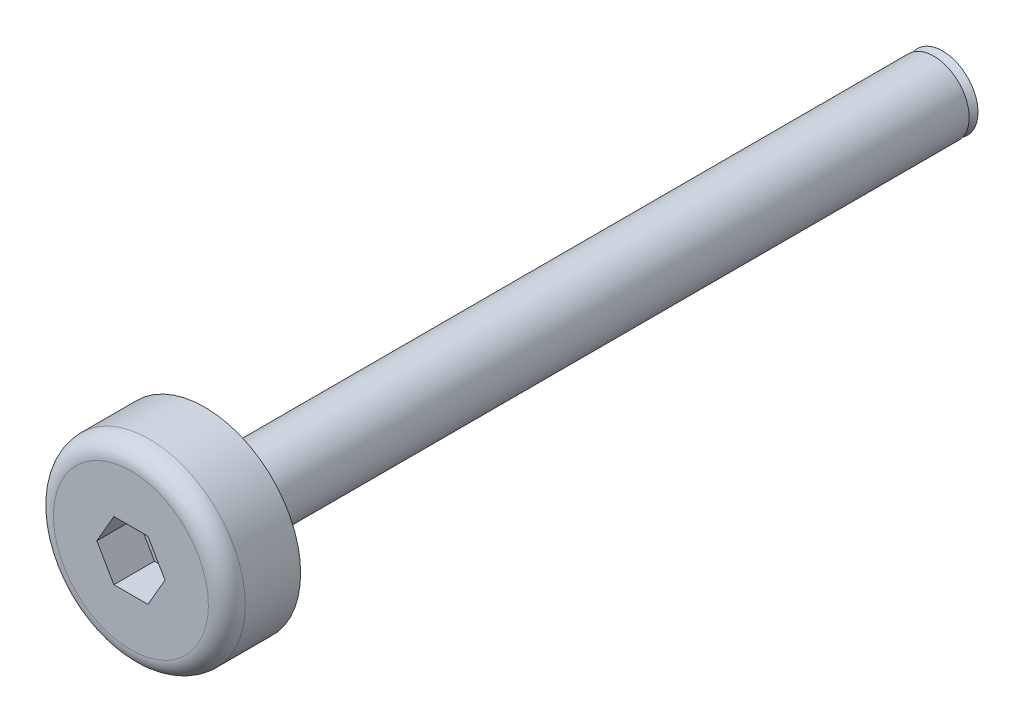
ISO-10303-21;
HEADER;
FILE_DESCRIPTION(('STEP AP214'),'2;1');
FILE_NAME('part.step','',(''),(''),'','','');
FILE_SCHEMA(('AUTOMOTIVE_DESIGN { 1 0 10303 214 1 1 1 1 }'));
ENDSEC;
DATA;
#1=APPLICATION_CONTEXT('core data for automotive mechanical design processes');
#2=APPLICATION_PROTOCOL_DEFINITION('international standard','automotive_design',2000,#1);
#3=PRODUCT_CONTEXT('',#1,'mechanical');
#4=PRODUCT('Part','Part','',(#3));
#5=PRODUCT_RELATED_PRODUCT_CATEGORY('part','',(#4));
#6=PRODUCT_DEFINITION_FORMATION('','',#4);
#7=PRODUCT_DEFINITION_CONTEXT('part definition',#1,'design');
#8=PRODUCT_DEFINITION('design','',#6,#7);
#9=PRODUCT_DEFINITION_SHAPE('','',#8);
#10=(LENGTH_UNIT() NAMED_UNIT(*) SI_UNIT(.MILLI.,.METRE.));
#11=(NAMED_UNIT(*) PLANE_ANGLE_UNIT() SI_UNIT($,.RADIAN.));
#12=(NAMED_UNIT(*) SI_UNIT($,.STERADIAN.) SOLID_ANGLE_UNIT());
#13=UNCERTAINTY_MEASURE_WITH_UNIT(LENGTH_MEASURE(1.E-05),#10,'distance_accuracy_value','');
#14=(GEOMETRIC_REPRESENTATION_CONTEXT(3) GLOBAL_UNCERTAINTY_ASSIGNED_CONTEXT((#13)) GLOBAL_UNIT_ASSIGNED_CONTEXT((#10,
#11,#12)) REPRESENTATION_CONTEXT('',''));
#15=CARTESIAN_POINT('',(0.,0.,0.));
#16=DIRECTION('',(0.,0.,1.));
#17=DIRECTION('',(1.,0.,0.));
#18=AXIS2_PLACEMENT_3D('',#15,#16,#17);
#19=CARTESIAN_POINT('',(0.,0.,2.5));
#20=DIRECTION('',(0.,0.,1.));
#21=DIRECTION('',(1.,0.,0.));
#22=AXIS2_PLACEMENT_3D('',#19,#20,#21);
#23=PLANE('',#22);
#24=CARTESIAN_POINT('',(0.,0.,2.5));
#25=DIRECTION('',(0.,0.,1.));
#26=DIRECTION('',(1.,0.,0.));
#27=AXIS2_PLACEMENT_3D('',#24,#25,#26);
#28=CIRCLE('',#27,2.625);
#29=CARTESIAN_POINT('',(2.625,0.,2.5));
#30=VERTEX_POINT('',#29);
#31=EDGE_CURVE('E142',#30,#30,#28,.T.);
#32=ORIENTED_EDGE('',*,*,#31,.T.);
#33=EDGE_LOOP('',(#32));
#34=FACE_BOUND('',#33,.T.);
#35=DIRECTION('',(0.5,-0.866025403784439,0.));
#36=VECTOR('',#35,1.);
#37=CARTESIAN_POINT('',(0.866025403784439,0.5,2.5));
#38=LINE('',#37,#36);
#39=CARTESIAN_POINT('',(0.577350269189626,1.,2.5));
#40=VERTEX_POINT('',#39);
#41=CARTESIAN_POINT('',(1.15470053837925,0.,2.5));
#42=VERTEX_POINT('',#41);
#43=EDGE_CURVE('E51',#40,#42,#38,.T.);
#44=ORIENTED_EDGE('',*,*,#43,.T.);
#45=DIRECTION('',(-0.5,-0.866025403784439,0.));
#46=VECTOR('',#45,1.);
#47=CARTESIAN_POINT('',(0.866025403784439,-0.5,2.5));
#48=LINE('',#47,#46);
#49=CARTESIAN_POINT('',(0.577350269189626,-1.,2.5));
#50=VERTEX_POINT('',#49);
#51=EDGE_CURVE('E11',#42,#50,#48,.T.);
#52=ORIENTED_EDGE('',*,*,#51,.T.);
#53=DIRECTION('',(-1.,0.,0.));
#54=VECTOR('',#53,1.);
#55=CARTESIAN_POINT('',(0.,-1.,2.5));
#56=LINE('',#55,#54);
#57=CARTESIAN_POINT('',(-0.577350269189626,-1.,2.5));
#58=VERTEX_POINT('',#57);
#59=EDGE_CURVE('E148',#50,#58,#56,.T.);
#60=ORIENTED_EDGE('',*,*,#59,.T.);
#61=DIRECTION('',(-0.5,0.866025403784439,0.));
#62=VECTOR('',#61,1.);
#63=CARTESIAN_POINT('',(-0.866025403784439,-0.5,2.5));
#64=LINE('',#63,#62);
#65=CARTESIAN_POINT('',(-1.15470053837925,0.,2.5));
#66=VERTEX_POINT('',#65);
#67=EDGE_CURVE('E151',#58,#66,#64,.T.);
#68=ORIENTED_EDGE('',*,*,#67,.T.);
#69=DIRECTION('',(0.5,0.866025403784439,0.));
#70=VECTOR('',#69,1.);
#71=CARTESIAN_POINT('',(-0.866025403784438,0.5,2.5));
#72=LINE('',#71,#70);
#73=CARTESIAN_POINT('',(-0.577350269189625,0.999999999999999,2.5));
#74=VERTEX_POINT('',#73);
#75=EDGE_CURVE('E154',#66,#74,#72,.T.);
#76=ORIENTED_EDGE('',*,*,#75,.T.);
#77=DIRECTION('',(1.,0.,0.));
#78=VECTOR('',#77,1.);
#79=CARTESIAN_POINT('',(0.,1.,2.5));
#80=LINE('',#79,#78);
#81=EDGE_CURVE('E157',#74,#40,#80,.T.);
#82=ORIENTED_EDGE('',*,*,#81,.T.);
#83=EDGE_LOOP('',(#44,#52,#60,#68,#76,#82));
#84=FACE_BOUND('',#83,.T.);
#85=ADVANCED_FACE('F43',(#34,#84),#23,.T.);
#86=CARTESIAN_POINT('',(0.,0.,2.5));
#87=DIRECTION('',(0.,0.,-1.));
#88=DIRECTION('',(-1.,0.,0.));
#89=AXIS2_PLACEMENT_3D('',#86,#87,#88);
#90=CYLINDRICAL_SURFACE('',#89,3.25);
#91=CARTESIAN_POINT('',(0.,0.,1.875));
#92=DIRECTION('',(0.,0.,1.));
#93=DIRECTION('',(1.,0.,0.));
#94=AXIS2_PLACEMENT_3D('',#91,#92,#93);
#95=CIRCLE('',#94,3.25);
#96=CARTESIAN_POINT('',(3.25,0.,1.875));
#97=VERTEX_POINT('',#96);
#98=EDGE_CURVE('E145',#97,#97,#95,.F.);
#99=ORIENTED_EDGE('',*,*,#98,.T.);
#100=EDGE_LOOP('',(#99));
#101=FACE_BOUND('',#100,.T.);
#102=CARTESIAN_POINT('',(0.,0.,0.));
#103=DIRECTION('',(0.,0.,1.));
#104=DIRECTION('',(1.,0.,0.));
#105=AXIS2_PLACEMENT_3D('',#102,#103,#104);
#106=CIRCLE('',#105,3.25);
#107=CARTESIAN_POINT('',(3.25,0.,0.));
#108=VERTEX_POINT('',#107);
#109=EDGE_CURVE('E100',#108,#108,#106,.T.);
#110=ORIENTED_EDGE('',*,*,#109,.T.);
#111=EDGE_LOOP('',(#110));
#112=FACE_BOUND('',#111,.T.);
#113=ADVANCED_FACE('F181',(#101,#112),#90,.T.);
#114=CARTESIAN_POINT('',(0.,0.,0.));
#115=DIRECTION('',(0.,0.,1.));
#116=DIRECTION('',(1.,0.,0.));
#117=AXIS2_PLACEMENT_3D('',#114,#115,#116);
#118=PLANE('',#117);
#119=CARTESIAN_POINT('',(0.,0.,0.));
#120=DIRECTION('',(0.,0.,1.));
#121=DIRECTION('',(1.,0.,0.));
#122=AXIS2_PLACEMENT_3D('',#119,#120,#121);
#123=CIRCLE('',#122,1.2);
#124=CARTESIAN_POINT('',(1.2,0.,0.));
#125=VERTEX_POINT('',#124);
#126=EDGE_CURVE('E119',#125,#125,#123,.T.);
#127=ORIENTED_EDGE('',*,*,#126,.T.);
#128=EDGE_LOOP('',(#127));
#129=FACE_BOUND('',#128,.T.);
#130=ORIENTED_EDGE('',*,*,#109,.F.);
#131=EDGE_LOOP('',(#130));
#132=FACE_BOUND('',#131,.T.);
#133=ADVANCED_FACE('F187',(#129,#132),#118,.F.);
#134=CARTESIAN_POINT('',(0.,0.,1.875));
#135=DIRECTION('',(0.,0.,1.));
#136=DIRECTION('',(1.,0.,0.));
#137=AXIS2_PLACEMENT_3D('',#134,#135,#136);
#138=TOROIDAL_SURFACE('',#137,2.625,0.625);
#139=ORIENTED_EDGE('',*,*,#98,.F.);
#140=EDGE_LOOP('',(#139));
#141=FACE_BOUND('',#140,.T.);
#142=ORIENTED_EDGE('',*,*,#31,.F.);
#143=EDGE_LOOP('',(#142));
#144=FACE_BOUND('',#143,.T.);
#145=ADVANCED_FACE('F45',(#141,#144),#138,.T.);
#146=CARTESIAN_POINT('',(0.577350269189626,-1.,2.51));
#147=DIRECTION('',(-0.866025403784439,0.5,0.));
#148=DIRECTION('',(-0.5,-0.866025403784439,0.));
#149=AXIS2_PLACEMENT_3D('',#146,#147,#148);
#150=PLANE('',#149);
#151=DIRECTION('',(0.,0.,-1.));
#152=VECTOR('',#151,1.);
#153=CARTESIAN_POINT('',(1.15470053837925,0.,2.51));
#154=LINE('',#153,#152);
#155=CARTESIAN_POINT('',(1.15470053837925,0.,1.125));
#156=VERTEX_POINT('',#155);
#157=EDGE_CURVE('E93',#42,#156,#154,.T.);
#158=ORIENTED_EDGE('',*,*,#157,.T.);
#159=DIRECTION('',(0.5,0.866025403784439,0.));
#160=VECTOR('',#159,1.);
#161=CARTESIAN_POINT('',(0.577350269189626,-1.,1.125));
#162=LINE('',#161,#160);
#163=CARTESIAN_POINT('',(0.577350269189626,-1.,1.125));
#164=VERTEX_POINT('',#163);
#165=EDGE_CURVE('E97',#164,#156,#162,.T.);
#166=ORIENTED_EDGE('',*,*,#165,.F.);
#167=DIRECTION('',(0.,0.,-1.));
#168=VECTOR('',#167,1.);
#169=CARTESIAN_POINT('',(0.577350269189626,-1.,2.51));
#170=LINE('',#169,#168);
#171=EDGE_CURVE('E132',#50,#164,#170,.T.);
#172=ORIENTED_EDGE('',*,*,#171,.F.);
#173=ORIENTED_EDGE('',*,*,#51,.F.);
#174=EDGE_LOOP('',(#158,#166,#172,#173));
#175=FACE_BOUND('',#174,.T.);
#176=ADVANCED_FACE('F95',(#175),#150,.T.);
#177=CARTESIAN_POINT('',(1.15470053837925,0.,2.51));
#178=DIRECTION('',(-0.866025403784439,-0.5,0.));
#179=DIRECTION('',(0.,0.,1.));
#180=AXIS2_PLACEMENT_3D('',#177,#178,#179);
#181=PLANE('',#180);
#182=DIRECTION('',(0.,0.,-1.));
#183=VECTOR('',#182,1.);
#184=CARTESIAN_POINT('',(0.577350269189626,1.,2.51));
#185=LINE('',#184,#183);
#186=CARTESIAN_POINT('',(0.577350269189626,1.,1.125));
#187=VERTEX_POINT('',#186);
#188=EDGE_CURVE('E101',#40,#187,#185,.T.);
#189=ORIENTED_EDGE('',*,*,#188,.T.);
#190=DIRECTION('',(-0.5,0.866025403784439,0.));
#191=VECTOR('',#190,1.);
#192=CARTESIAN_POINT('',(1.15470053837925,0.,1.125));
#193=LINE('',#192,#191);
#194=EDGE_CURVE('E104',#156,#187,#193,.T.);
#195=ORIENTED_EDGE('',*,*,#194,.F.);
#196=ORIENTED_EDGE('',*,*,#157,.F.);
#197=ORIENTED_EDGE('',*,*,#43,.F.);
#198=EDGE_LOOP('',(#189,#195,#196,#197));
#199=FACE_BOUND('',#198,.T.);
#200=ADVANCED_FACE('F105',(#199),#181,.T.);
#201=CARTESIAN_POINT('',(0.577350269189626,1.,2.51));
#202=DIRECTION('',(0.,-1.,0.));
#203=DIRECTION('',(1.,0.,0.));
#204=AXIS2_PLACEMENT_3D('',#201,#202,#203);
#205=PLANE('',#204);
#206=DIRECTION('',(0.,0.,-1.));
#207=VECTOR('',#206,1.);
#208=CARTESIAN_POINT('',(-0.577350269189625,0.999999999999999,2.51));
#209=LINE('',#208,#207);
#210=CARTESIAN_POINT('',(-0.577350269189625,0.999999999999999,1.125));
#211=VERTEX_POINT('',#210);
#212=EDGE_CURVE('E137',#74,#211,#209,.T.);
#213=ORIENTED_EDGE('',*,*,#212,.T.);
#214=DIRECTION('',(-1.,0.,0.));
#215=VECTOR('',#214,1.);
#216=CARTESIAN_POINT('',(0.577350269189626,1.,1.125));
#217=LINE('',#216,#215);
#218=EDGE_CURVE('E110',#187,#211,#217,.T.);
#219=ORIENTED_EDGE('',*,*,#218,.F.);
#220=ORIENTED_EDGE('',*,*,#188,.F.);
#221=ORIENTED_EDGE('',*,*,#81,.F.);
#222=EDGE_LOOP('',(#213,#219,#220,#221));
#223=FACE_BOUND('',#222,.T.);
#224=ADVANCED_FACE('F161',(#223),#205,.T.);
#225=CARTESIAN_POINT('',(-0.577350269189625,0.999999999999999,2.51));
#226=DIRECTION('',(0.866025403784439,-0.5,0.));
#227=DIRECTION('',(0.5,0.866025403784439,0.));
#228=AXIS2_PLACEMENT_3D('',#225,#226,#227);
#229=PLANE('',#228);
#230=DIRECTION('',(0.,0.,-1.));
#231=VECTOR('',#230,1.);
#232=CARTESIAN_POINT('',(-1.15470053837925,0.,2.51));
#233=LINE('',#232,#231);
#234=CARTESIAN_POINT('',(-1.15470053837925,0.,1.125));
#235=VERTEX_POINT('',#234);
#236=EDGE_CURVE('E135',#66,#235,#233,.T.);
#237=ORIENTED_EDGE('',*,*,#236,.T.);
#238=DIRECTION('',(-0.5,-0.866025403784439,0.));
#239=VECTOR('',#238,1.);
#240=CARTESIAN_POINT('',(-0.577350269189625,0.999999999999999,1.125));
#241=LINE('',#240,#239);
#242=EDGE_CURVE('E126',#211,#235,#241,.T.);
#243=ORIENTED_EDGE('',*,*,#242,.F.);
#244=ORIENTED_EDGE('',*,*,#212,.F.);
#245=ORIENTED_EDGE('',*,*,#75,.F.);
#246=EDGE_LOOP('',(#237,#243,#244,#245));
#247=FACE_BOUND('',#246,.T.);
#248=ADVANCED_FACE('F166',(#247),#229,.T.);
#249=CARTESIAN_POINT('',(-1.15470053837925,0.,2.51));
#250=DIRECTION('',(0.866025403784439,0.5,0.));
#251=DIRECTION('',(-0.5,0.866025403784439,0.));
#252=AXIS2_PLACEMENT_3D('',#249,#250,#251);
#253=PLANE('',#252);
#254=DIRECTION('',(0.,0.,-1.));
#255=VECTOR('',#254,1.);
#256=CARTESIAN_POINT('',(-0.577350269189626,-1.,2.51));
#257=LINE('',#256,#255);
#258=CARTESIAN_POINT('',(-0.577350269189626,-1.,1.125));
#259=VERTEX_POINT('',#258);
#260=EDGE_CURVE('E58',#58,#259,#257,.T.);
#261=ORIENTED_EDGE('',*,*,#260,.T.);
#262=DIRECTION('',(0.5,-0.866025403784439,0.));
#263=VECTOR('',#262,1.);
#264=CARTESIAN_POINT('',(-1.15470053837925,0.,1.125));
#265=LINE('',#264,#263);
#266=EDGE_CURVE('E129',#235,#259,#265,.T.);
#267=ORIENTED_EDGE('',*,*,#266,.F.);
#268=ORIENTED_EDGE('',*,*,#236,.F.);
#269=ORIENTED_EDGE('',*,*,#67,.F.);
#270=EDGE_LOOP('',(#261,#267,#268,#269));
#271=FACE_BOUND('',#270,.T.);
#272=ADVANCED_FACE('F169',(#271),#253,.T.);
#273=CARTESIAN_POINT('',(-0.577350269189626,-1.,2.51));
#274=DIRECTION('',(0.,1.,0.));
#275=DIRECTION('',(-1.,0.,0.));
#276=AXIS2_PLACEMENT_3D('',#273,#274,#275);
#277=PLANE('',#276);
#278=ORIENTED_EDGE('',*,*,#171,.T.);
#279=DIRECTION('',(1.,0.,0.));
#280=VECTOR('',#279,1.);
#281=CARTESIAN_POINT('',(-0.577350269189626,-1.,1.125));
#282=LINE('',#281,#280);
#283=EDGE_CURVE('E115',#259,#164,#282,.T.);
#284=ORIENTED_EDGE('',*,*,#283,.F.);
#285=ORIENTED_EDGE('',*,*,#260,.F.);
#286=ORIENTED_EDGE('',*,*,#59,.F.);
#287=EDGE_LOOP('',(#278,#284,#285,#286));
#288=FACE_BOUND('',#287,.T.);
#289=ADVANCED_FACE('F170',(#288),#277,.T.);
#290=CARTESIAN_POINT('',(1.15470053837925,0.,1.125));
#291=DIRECTION('',(0.,0.,1.));
#292=DIRECTION('',(-0.5,0.866025403784439,0.));
#293=AXIS2_PLACEMENT_3D('',#290,#291,#292);
#294=PLANE('',#293);
#295=ORIENTED_EDGE('',*,*,#165,.T.);
#296=ORIENTED_EDGE('',*,*,#194,.T.);
#297=ORIENTED_EDGE('',*,*,#218,.T.);
#298=ORIENTED_EDGE('',*,*,#242,.T.);
#299=ORIENTED_EDGE('',*,*,#266,.T.);
#300=ORIENTED_EDGE('',*,*,#283,.T.);
#301=EDGE_LOOP('',(#295,#296,#297,#298,#299,#300));
#302=FACE_BOUND('',#301,.T.);
#303=ADVANCED_FACE('F113',(#302),#294,.T.);
#304=CARTESIAN_POINT('',(0.,0.,0.));
#305=DIRECTION('',(0.,0.,-1.));
#306=DIRECTION('',(-1.,0.,0.));
#307=AXIS2_PLACEMENT_3D('',#304,#305,#306);
#308=CYLINDRICAL_SURFACE('',#307,1.2);
#309=ORIENTED_EDGE('',*,*,#126,.F.);
#310=EDGE_LOOP('',(#309));
#311=FACE_BOUND('',#310,.T.);
#312=CARTESIAN_POINT('',(0.,0.,-24.7));
#313=DIRECTION('',(0.,0.,1.));
#314=DIRECTION('',(1.,0.,0.));
#315=AXIS2_PLACEMENT_3D('',#312,#313,#314);
#316=CIRCLE('',#315,1.2);
#317=CARTESIAN_POINT('',(1.2,0.,-24.7));
#318=VERTEX_POINT('',#317);
#319=EDGE_CURVE('E122',#318,#318,#316,.T.);
#320=ORIENTED_EDGE('',*,*,#319,.T.);
#321=EDGE_LOOP('',(#320));
#322=FACE_BOUND('',#321,.T.);
#323=ADVANCED_FACE('F177',(#311,#322),#308,.T.);
#324=CARTESIAN_POINT('',(0.,0.,-24.7));
#325=DIRECTION('',(0.,0.,1.));
#326=DIRECTION('',(1.,0.,0.));
#327=AXIS2_PLACEMENT_3D('',#324,#325,#326);
#328=PLANE('',#327);
#329=CARTESIAN_POINT('',(0.,0.,-24.7));
#330=DIRECTION('',(0.,0.,-1.));
#331=DIRECTION('',(0.,1.,0.));
#332=AXIS2_PLACEMENT_3D('',#329,#330,#331);
#333=CIRCLE('',#332,0.9);
#334=CARTESIAN_POINT('',(0.,0.9,-24.7));
#335=VERTEX_POINT('',#334);
#336=EDGE_CURVE('E116',#335,#335,#333,.T.);
#337=ORIENTED_EDGE('',*,*,#336,.F.);
#338=EDGE_LOOP('',(#337));
#339=FACE_BOUND('',#338,.T.);
#340=ORIENTED_EDGE('',*,*,#319,.F.);
#341=EDGE_LOOP('',(#340));
#342=FACE_BOUND('',#341,.T.);
#343=ADVANCED_FACE('F219',(#339,#342),#328,.F.);
#344=CARTESIAN_POINT('',(0.,0.,-25.));
#345=DIRECTION('',(0.,0.,-1.));
#346=DIRECTION('',(0.,1.,0.));
#347=AXIS2_PLACEMENT_3D('',#344,#345,#346);
#348=PLANE('',#347);
#349=CARTESIAN_POINT('',(0.,0.,-25.));
#350=DIRECTION('',(0.,0.,-1.));
#351=DIRECTION('',(0.,1.,0.));
#352=AXIS2_PLACEMENT_3D('',#349,#350,#351);
#353=CIRCLE('',#352,1.2);
#354=CARTESIAN_POINT('',(0.,1.2,-25.));
#355=VERTEX_POINT('',#354);
#356=EDGE_CURVE('E205',#355,#355,#353,.T.);
#357=ORIENTED_EDGE('',*,*,#356,.T.);
#358=EDGE_LOOP('',(#357));
#359=FACE_BOUND('',#358,.T.);
#360=ADVANCED_FACE('F210',(#359),#348,.T.);
#361=CARTESIAN_POINT('',(0.,0.,-25.));
#362=DIRECTION('',(0.,0.,-1.));
#363=DIRECTION('',(0.,1.,0.));
#364=AXIS2_PLACEMENT_3D('',#361,#362,#363);
#365=CONICAL_SURFACE('',#364,1.2,0.785398163397457);
#366=ORIENTED_EDGE('',*,*,#336,.T.);
#367=EDGE_LOOP('',(#366));
#368=FACE_BOUND('',#367,.T.);
#369=ORIENTED_EDGE('',*,*,#356,.F.);
#370=EDGE_LOOP('',(#369));
#371=FACE_BOUND('',#370,.T.);
#372=ADVANCED_FACE('F212',(#368,#371),#365,.T.);
#373=CLOSED_SHELL('',(#85,#113,#133,#145,#176,#200,#224,#248,#272,#289,#303,#323,#343,#360,#372));
#374=MANIFOLD_SOLID_BREP('B2',#373);
#375=ADVANCED_BREP_SHAPE_REPRESENTATION('',(#18,#374),#14);
#376=SHAPE_DEFINITION_REPRESENTATION(#9,#375);
ENDSEC;
END-ISO-10303-21;
